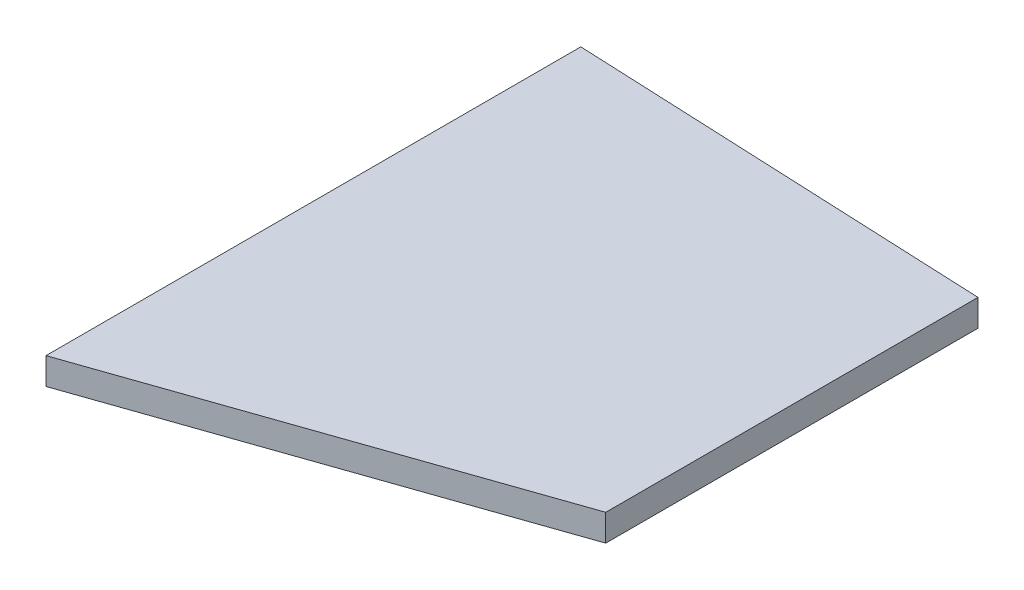
ISO-10303-21;
HEADER;
FILE_DESCRIPTION(('STEP AP214'),'2;1');
FILE_NAME('part.step','',(''),(''),'','','');
FILE_SCHEMA(('AUTOMOTIVE_DESIGN { 1 0 10303 214 1 1 1 1 }'));
ENDSEC;
DATA;
#1=APPLICATION_CONTEXT('core data for automotive mechanical design processes');
#2=APPLICATION_PROTOCOL_DEFINITION('international standard','automotive_design',2000,#1);
#3=PRODUCT_CONTEXT('',#1,'mechanical');
#4=PRODUCT('Part','Part','',(#3));
#5=PRODUCT_RELATED_PRODUCT_CATEGORY('part','',(#4));
#6=PRODUCT_DEFINITION_FORMATION('','',#4);
#7=PRODUCT_DEFINITION_CONTEXT('part definition',#1,'design');
#8=PRODUCT_DEFINITION('design','',#6,#7);
#9=PRODUCT_DEFINITION_SHAPE('','',#8);
#10=(LENGTH_UNIT() NAMED_UNIT(*) SI_UNIT(.MILLI.,.METRE.));
#11=(NAMED_UNIT(*) PLANE_ANGLE_UNIT() SI_UNIT($,.RADIAN.));
#12=(NAMED_UNIT(*) SI_UNIT($,.STERADIAN.) SOLID_ANGLE_UNIT());
#13=UNCERTAINTY_MEASURE_WITH_UNIT(LENGTH_MEASURE(1.E-05),#10,'distance_accuracy_value','');
#14=(GEOMETRIC_REPRESENTATION_CONTEXT(3) GLOBAL_UNCERTAINTY_ASSIGNED_CONTEXT((#13)) GLOBAL_UNIT_ASSIGNED_CONTEXT((#10,
#11,#12)) REPRESENTATION_CONTEXT('',''));
#15=CARTESIAN_POINT('',(0.,0.,0.));
#16=DIRECTION('',(0.,0.,1.));
#17=DIRECTION('',(1.,0.,0.));
#18=AXIS2_PLACEMENT_3D('',#15,#16,#17);
#19=CARTESIAN_POINT('',(42.2827084526884,5.715,-117.204072574995));
#20=DIRECTION('',(0.0441808520392469,0.,-0.999023549428684));
#21=DIRECTION('',(-0.999023549428684,0.,-0.0441808520392469));
#22=AXIS2_PLACEMENT_3D('',#19,#20,#21);
#23=PLANE('',#22);
#24=DIRECTION('',(0.999023549428684,0.,0.0441808520392469));
#25=VECTOR('',#24,1.);
#26=CARTESIAN_POINT('',(42.2827084526884,0.,-117.204072574995));
#27=LINE('',#26,#25);
#28=CARTESIAN_POINT('',(107.95,0.,-114.3));
#29=VERTEX_POINT('',#28);
#30=CARTESIAN_POINT('',(196.76319354421,0.,-110.372322253711));
#31=VERTEX_POINT('',#30);
#32=EDGE_CURVE('E96',#29,#31,#27,.T.);
#33=ORIENTED_EDGE('',*,*,#32,.F.);
#34=DIRECTION('',(0.,-1.,0.));
#35=VECTOR('',#34,1.);
#36=CARTESIAN_POINT('',(107.95,5.715,-114.3));
#37=LINE('',#36,#35);
#38=CARTESIAN_POINT('',(107.95,5.715,-114.3));
#39=VERTEX_POINT('',#38);
#40=EDGE_CURVE('E11',#39,#29,#37,.T.);
#41=ORIENTED_EDGE('',*,*,#40,.F.);
#42=DIRECTION('',(0.999023549428684,0.,0.0441808520392469));
#43=VECTOR('',#42,1.);
#44=CARTESIAN_POINT('',(42.2827084526884,5.715,-117.204072574995));
#45=LINE('',#44,#43);
#46=CARTESIAN_POINT('',(196.76319354421,5.715,-110.372322253711));
#47=VERTEX_POINT('',#46);
#48=EDGE_CURVE('E81',#39,#47,#45,.T.);
#49=ORIENTED_EDGE('',*,*,#48,.T.);
#50=DIRECTION('',(0.,-1.,0.));
#51=VECTOR('',#50,1.);
#52=CARTESIAN_POINT('',(196.76319354421,5.715,-110.372322253711));
#53=LINE('',#52,#51);
#54=EDGE_CURVE('E49',#47,#31,#53,.T.);
#55=ORIENTED_EDGE('',*,*,#54,.T.);
#56=EDGE_LOOP('',(#33,#41,#49,#55));
#57=FACE_BOUND('',#56,.T.);
#58=ADVANCED_FACE('F33',(#57),#23,.T.);
#59=CARTESIAN_POINT('',(107.95,5.715,-57.15));
#60=DIRECTION('',(1.,0.,0.));
#61=DIRECTION('',(0.,0.,-1.));
#62=AXIS2_PLACEMENT_3D('',#59,#60,#61);
#63=PLANE('',#62);
#64=DIRECTION('',(0.,0.,1.));
#65=VECTOR('',#64,1.);
#66=CARTESIAN_POINT('',(107.95,0.,-57.15));
#67=LINE('',#66,#65);
#68=CARTESIAN_POINT('',(107.95,0.,0.));
#69=VERTEX_POINT('',#68);
#70=EDGE_CURVE('E87',#29,#69,#67,.T.);
#71=ORIENTED_EDGE('',*,*,#70,.T.);
#72=DIRECTION('',(0.,-1.,0.));
#73=VECTOR('',#72,1.);
#74=CARTESIAN_POINT('',(107.95,5.715,0.));
#75=LINE('',#74,#73);
#76=CARTESIAN_POINT('',(107.95,5.715,0.));
#77=VERTEX_POINT('',#76);
#78=EDGE_CURVE('E41',#77,#69,#75,.T.);
#79=ORIENTED_EDGE('',*,*,#78,.F.);
#80=DIRECTION('',(0.,0.,1.));
#81=VECTOR('',#80,1.);
#82=CARTESIAN_POINT('',(107.95,5.715,-57.15));
#83=LINE('',#82,#81);
#84=EDGE_CURVE('E75',#39,#77,#83,.T.);
#85=ORIENTED_EDGE('',*,*,#84,.F.);
#86=ORIENTED_EDGE('',*,*,#40,.T.);
#87=EDGE_LOOP('',(#71,#79,#85,#86));
#88=FACE_BOUND('',#87,.T.);
#89=ADVANCED_FACE('F85',(#88),#63,.F.);
#90=CARTESIAN_POINT('',(64.6666159443412,5.715,15.0178359482424));
#91=DIRECTION('',(-0.327795139186997,0.,-0.944748827321515));
#92=DIRECTION('',(-0.944748827321515,0.,0.327795139186997));
#93=AXIS2_PLACEMENT_3D('',#90,#91,#92);
#94=PLANE('',#93);
#95=DIRECTION('',(0.944748827321515,0.,-0.327795139186997));
#96=VECTOR('',#95,1.);
#97=CARTESIAN_POINT('',(64.6666159443412,0.,15.0178359482424));
#98=LINE('',#97,#96);
#99=CARTESIAN_POINT('',(196.76319354421,0.,-30.8151037583225));
#100=VERTEX_POINT('',#99);
#101=EDGE_CURVE('E99',#69,#100,#98,.T.);
#102=ORIENTED_EDGE('',*,*,#101,.T.);
#103=DIRECTION('',(0.,-1.,0.));
#104=VECTOR('',#103,1.);
#105=CARTESIAN_POINT('',(196.76319354421,5.715,-30.8151037583225));
#106=LINE('',#105,#104);
#107=CARTESIAN_POINT('',(196.76319354421,5.715,-30.8151037583225));
#108=VERTEX_POINT('',#107);
#109=EDGE_CURVE('E63',#108,#100,#106,.T.);
#110=ORIENTED_EDGE('',*,*,#109,.F.);
#111=DIRECTION('',(0.944748827321515,0.,-0.327795139186997));
#112=VECTOR('',#111,1.);
#113=CARTESIAN_POINT('',(64.6666159443412,5.715,15.0178359482424));
#114=LINE('',#113,#112);
#115=EDGE_CURVE('E80',#77,#108,#114,.T.);
#116=ORIENTED_EDGE('',*,*,#115,.F.);
#117=ORIENTED_EDGE('',*,*,#78,.T.);
#118=EDGE_LOOP('',(#102,#110,#116,#117));
#119=FACE_BOUND('',#118,.T.);
#120=ADVANCED_FACE('F90',(#119),#94,.F.);
#121=CARTESIAN_POINT('',(196.76319354421,5.715,-57.15));
#122=DIRECTION('',(1.,0.,0.));
#123=DIRECTION('',(0.,0.,-1.));
#124=AXIS2_PLACEMENT_3D('',#121,#122,#123);
#125=PLANE('',#124);
#126=DIRECTION('',(0.,0.,1.));
#127=VECTOR('',#126,1.);
#128=CARTESIAN_POINT('',(196.76319354421,0.,-57.15));
#129=LINE('',#128,#127);
#130=EDGE_CURVE('E101',#31,#100,#129,.T.);
#131=ORIENTED_EDGE('',*,*,#130,.F.);
#132=ORIENTED_EDGE('',*,*,#54,.F.);
#133=DIRECTION('',(0.,0.,1.));
#134=VECTOR('',#133,1.);
#135=CARTESIAN_POINT('',(196.76319354421,5.715,-57.15));
#136=LINE('',#135,#134);
#137=EDGE_CURVE('E91',#47,#108,#136,.T.);
#138=ORIENTED_EDGE('',*,*,#137,.T.);
#139=ORIENTED_EDGE('',*,*,#109,.T.);
#140=EDGE_LOOP('',(#131,#132,#138,#139));
#141=FACE_BOUND('',#140,.T.);
#142=ADVANCED_FACE('F106',(#141),#125,.T.);
#143=CARTESIAN_POINT('',(39.6268750678724,5.715,-57.15));
#144=DIRECTION('',(0.,1.,0.));
#145=DIRECTION('',(0.,0.,1.));
#146=AXIS2_PLACEMENT_3D('',#143,#144,#145);
#147=PLANE('',#146);
#148=ORIENTED_EDGE('',*,*,#48,.F.);
#149=ORIENTED_EDGE('',*,*,#84,.T.);
#150=ORIENTED_EDGE('',*,*,#115,.T.);
#151=ORIENTED_EDGE('',*,*,#137,.F.);
#152=EDGE_LOOP('',(#148,#149,#150,#151));
#153=FACE_BOUND('',#152,.T.);
#154=ADVANCED_FACE('F77',(#153),#147,.T.);
#155=CARTESIAN_POINT('',(39.6268750678724,0.,-57.15));
#156=DIRECTION('',(0.,1.,0.));
#157=DIRECTION('',(0.,0.,1.));
#158=AXIS2_PLACEMENT_3D('',#155,#156,#157);
#159=PLANE('',#158);
#160=ORIENTED_EDGE('',*,*,#32,.T.);
#161=ORIENTED_EDGE('',*,*,#130,.T.);
#162=ORIENTED_EDGE('',*,*,#101,.F.);
#163=ORIENTED_EDGE('',*,*,#70,.F.);
#164=EDGE_LOOP('',(#160,#161,#162,#163));
#165=FACE_BOUND('',#164,.T.);
#166=ADVANCED_FACE('F113',(#165),#159,.F.);
#167=CLOSED_SHELL('',(#58,#89,#120,#142,#154,#166));
#168=MANIFOLD_SOLID_BREP('B2',#167);
#169=ADVANCED_BREP_SHAPE_REPRESENTATION('',(#18,#168),#14);
#170=SHAPE_DEFINITION_REPRESENTATION(#9,#169);
ENDSEC;
END-ISO-10303-21;
